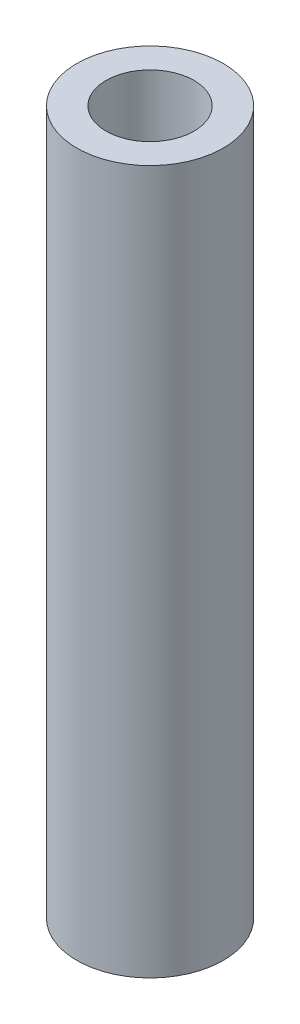
ISO-10303-21;
HEADER;
FILE_DESCRIPTION(('STEP AP214'),'2;1');
FILE_NAME('part.step','',(''),(''),'','','');
FILE_SCHEMA(('AUTOMOTIVE_DESIGN { 1 0 10303 214 1 1 1 1 }'));
ENDSEC;
DATA;
#1=APPLICATION_CONTEXT('core data for automotive mechanical design processes');
#2=APPLICATION_PROTOCOL_DEFINITION('international standard','automotive_design',2000,#1);
#3=PRODUCT_CONTEXT('',#1,'mechanical');
#4=PRODUCT('Part','Part','',(#3));
#5=PRODUCT_RELATED_PRODUCT_CATEGORY('part','',(#4));
#6=PRODUCT_DEFINITION_FORMATION('','',#4);
#7=PRODUCT_DEFINITION_CONTEXT('part definition',#1,'design');
#8=PRODUCT_DEFINITION('design','',#6,#7);
#9=PRODUCT_DEFINITION_SHAPE('','',#8);
#10=(LENGTH_UNIT() NAMED_UNIT(*) SI_UNIT(.MILLI.,.METRE.));
#11=(NAMED_UNIT(*) PLANE_ANGLE_UNIT() SI_UNIT($,.RADIAN.));
#12=(NAMED_UNIT(*) SI_UNIT($,.STERADIAN.) SOLID_ANGLE_UNIT());
#13=UNCERTAINTY_MEASURE_WITH_UNIT(LENGTH_MEASURE(1.E-05),#10,'distance_accuracy_value','');
#14=(GEOMETRIC_REPRESENTATION_CONTEXT(3) GLOBAL_UNCERTAINTY_ASSIGNED_CONTEXT((#13)) GLOBAL_UNIT_ASSIGNED_CONTEXT((#10,
#11,#12)) REPRESENTATION_CONTEXT('',''));
#15=CARTESIAN_POINT('',(0.,0.,0.));
#16=DIRECTION('',(0.,0.,1.));
#17=DIRECTION('',(1.,0.,0.));
#18=AXIS2_PLACEMENT_3D('',#15,#16,#17);
#19=CARTESIAN_POINT('',(0.,76.2,0.));
#20=DIRECTION('',(0.,1.,0.));
#21=DIRECTION('',(0.,0.,1.));
#22=AXIS2_PLACEMENT_3D('',#19,#20,#21);
#23=PLANE('',#22);
#24=CARTESIAN_POINT('',(0.,76.2,0.));
#25=DIRECTION('',(0.,1.,0.));
#26=DIRECTION('',(0.,0.,1.));
#27=AXIS2_PLACEMENT_3D('',#24,#25,#26);
#28=CIRCLE('',#27,7.9375);
#29=CARTESIAN_POINT('',(0.,76.2,-7.9375));
#30=VERTEX_POINT('',#29);
#31=EDGE_CURVE('E10',#30,#30,#28,.T.);
#32=ORIENTED_EDGE('',*,*,#31,.T.);
#33=EDGE_LOOP('',(#32));
#34=FACE_BOUND('',#33,.T.);
#35=CARTESIAN_POINT('',(0.,76.2,0.));
#36=DIRECTION('',(0.,1.,0.));
#37=DIRECTION('',(0.,0.,1.));
#38=AXIS2_PLACEMENT_3D('',#35,#36,#37);
#39=CIRCLE('',#38,4.7625);
#40=CARTESIAN_POINT('',(0.,76.2,-4.7625));
#41=VERTEX_POINT('',#40);
#42=EDGE_CURVE('E42',#41,#41,#39,.T.);
#43=ORIENTED_EDGE('',*,*,#42,.F.);
#44=EDGE_LOOP('',(#43));
#45=FACE_BOUND('',#44,.T.);
#46=ADVANCED_FACE('F31',(#34,#45),#23,.T.);
#47=CARTESIAN_POINT('',(0.,0.,0.));
#48=DIRECTION('',(0.,1.,0.));
#49=DIRECTION('',(0.,0.,1.));
#50=AXIS2_PLACEMENT_3D('',#47,#48,#49);
#51=PLANE('',#50);
#52=CARTESIAN_POINT('',(0.,0.,0.));
#53=DIRECTION('',(0.,1.,0.));
#54=DIRECTION('',(0.,0.,1.));
#55=AXIS2_PLACEMENT_3D('',#52,#53,#54);
#56=CIRCLE('',#55,7.9375);
#57=CARTESIAN_POINT('',(0.,0.,-7.9375));
#58=VERTEX_POINT('',#57);
#59=EDGE_CURVE('E35',#58,#58,#56,.T.);
#60=ORIENTED_EDGE('',*,*,#59,.F.);
#61=EDGE_LOOP('',(#60));
#62=FACE_BOUND('',#61,.T.);
#63=CARTESIAN_POINT('',(0.,0.,0.));
#64=DIRECTION('',(0.,1.,0.));
#65=DIRECTION('',(0.,0.,1.));
#66=AXIS2_PLACEMENT_3D('',#63,#64,#65);
#67=CIRCLE('',#66,4.7625);
#68=CARTESIAN_POINT('',(0.,0.,-4.7625));
#69=VERTEX_POINT('',#68);
#70=EDGE_CURVE('E44',#69,#69,#67,.T.);
#71=ORIENTED_EDGE('',*,*,#70,.T.);
#72=EDGE_LOOP('',(#71));
#73=FACE_BOUND('',#72,.T.);
#74=ADVANCED_FACE('F54',(#62,#73),#51,.F.);
#75=CARTESIAN_POINT('',(0.,76.2,0.));
#76=DIRECTION('',(0.,-1.,0.));
#77=DIRECTION('',(0.,0.,-1.));
#78=AXIS2_PLACEMENT_3D('',#75,#76,#77);
#79=CYLINDRICAL_SURFACE('',#78,7.9375);
#80=CARTESIAN_POINT('',(0.,76.2,-7.9375));
#81=CARTESIAN_POINT('',(0.,75.40625,-7.9375));
#82=CARTESIAN_POINT('',(0.,74.6125,-7.9375));
#83=CARTESIAN_POINT('',(0.,73.025,-7.9375));
#84=CARTESIAN_POINT('',(0.,72.23125,-7.9375));
#85=CARTESIAN_POINT('',(0.,70.64375,-7.9375));
#86=CARTESIAN_POINT('',(0.,69.85,-7.9375));
#87=CARTESIAN_POINT('',(0.,68.2625,-7.9375));
#88=CARTESIAN_POINT('',(0.,67.46875,-7.9375));
#89=CARTESIAN_POINT('',(0.,65.88125,-7.9375));
#90=CARTESIAN_POINT('',(0.,65.0875,-7.9375));
#91=CARTESIAN_POINT('',(0.,63.5,-7.9375));
#92=CARTESIAN_POINT('',(0.,62.70625,-7.9375));
#93=CARTESIAN_POINT('',(0.,61.11875,-7.9375));
#94=CARTESIAN_POINT('',(0.,60.325,-7.9375));
#95=CARTESIAN_POINT('',(0.,58.7375,-7.9375));
#96=CARTESIAN_POINT('',(0.,57.94375,-7.9375));
#97=CARTESIAN_POINT('',(0.,56.35625,-7.9375));
#98=CARTESIAN_POINT('',(0.,55.5625,-7.9375));
#99=CARTESIAN_POINT('',(0.,53.975,-7.9375));
#100=CARTESIAN_POINT('',(0.,53.18125,-7.9375));
#101=CARTESIAN_POINT('',(0.,51.59375,-7.9375));
#102=CARTESIAN_POINT('',(0.,50.8,-7.9375));
#103=CARTESIAN_POINT('',(0.,49.2125,-7.9375));
#104=CARTESIAN_POINT('',(0.,48.41875,-7.9375));
#105=CARTESIAN_POINT('',(0.,46.83125,-7.9375));
#106=CARTESIAN_POINT('',(0.,46.0375,-7.9375));
#107=CARTESIAN_POINT('',(0.,44.45,-7.9375));
#108=CARTESIAN_POINT('',(0.,43.65625,-7.9375));
#109=CARTESIAN_POINT('',(0.,42.06875,-7.9375));
#110=CARTESIAN_POINT('',(0.,41.275,-7.9375));
#111=CARTESIAN_POINT('',(0.,39.6875,-7.9375));
#112=CARTESIAN_POINT('',(0.,38.89375,-7.9375));
#113=CARTESIAN_POINT('',(0.,37.30625,-7.9375));
#114=CARTESIAN_POINT('',(0.,36.5125,-7.9375));
#115=CARTESIAN_POINT('',(0.,34.925,-7.9375));
#116=CARTESIAN_POINT('',(0.,34.13125,-7.9375));
#117=CARTESIAN_POINT('',(0.,32.54375,-7.9375));
#118=CARTESIAN_POINT('',(0.,31.75,-7.9375));
#119=CARTESIAN_POINT('',(0.,30.1625,-7.9375));
#120=CARTESIAN_POINT('',(0.,29.36875,-7.9375));
#121=CARTESIAN_POINT('',(0.,27.78125,-7.9375));
#122=CARTESIAN_POINT('',(0.,26.9875,-7.9375));
#123=CARTESIAN_POINT('',(0.,25.4,-7.9375));
#124=CARTESIAN_POINT('',(0.,24.60625,-7.9375));
#125=CARTESIAN_POINT('',(0.,23.01875,-7.9375));
#126=CARTESIAN_POINT('',(0.,22.225,-7.9375));
#127=CARTESIAN_POINT('',(0.,20.6375,-7.9375));
#128=CARTESIAN_POINT('',(0.,19.84375,-7.9375));
#129=CARTESIAN_POINT('',(0.,18.25625,-7.9375));
#130=CARTESIAN_POINT('',(0.,17.4625,-7.9375));
#131=CARTESIAN_POINT('',(0.,15.875,-7.9375));
#132=CARTESIAN_POINT('',(0.,15.08125,-7.9375));
#133=CARTESIAN_POINT('',(0.,13.49375,-7.9375));
#134=CARTESIAN_POINT('',(0.,12.7,-7.9375));
#135=CARTESIAN_POINT('',(0.,11.1125,-7.9375));
#136=CARTESIAN_POINT('',(0.,10.31875,-7.9375));
#137=CARTESIAN_POINT('',(0.,8.73125,-7.9375));
#138=CARTESIAN_POINT('',(0.,7.93750000000001,-7.9375));
#139=CARTESIAN_POINT('',(0.,6.35,-7.9375));
#140=CARTESIAN_POINT('',(0.,5.55625,-7.9375));
#141=CARTESIAN_POINT('',(0.,3.96875,-7.9375));
#142=CARTESIAN_POINT('',(0.,3.175,-7.9375));
#143=CARTESIAN_POINT('',(0.,1.5875,-7.9375));
#144=CARTESIAN_POINT('',(0.,0.793750000000001,-7.9375));
#145=CARTESIAN_POINT('',(0.,0.,-7.9375));
#146=B_SPLINE_CURVE_WITH_KNOTS('',3,(#80,#81,#82,#83,#84,#85,#86,#87,#88,#89,#90,#91,#92,#93,
#94,#95,#96,#97,#98,#99,#100,#101,#102,#103,#104,#105,#106,#107,#108,#109,#110,#111,#112,#113,
#114,#115,#116,#117,#118,#119,#120,#121,#122,#123,#124,#125,#126,#127,#128,#129,#130,#131,#132,
#133,#134,#135,#136,#137,#138,#139,#140,#141,#142,#143,#144,#145),.UNSPECIFIED.,.F.,.F.,(4,2,2,
2,2,2,2,2,2,2,2,2,2,2,2,2,2,2,2,2,2,2,2,2,2,2,2,2,2,2,2,2,4),(0.,2.38124999999999,
4.76249999999999,7.14374999999999,9.52499999999999,11.90625,14.2875,16.66875,19.05,21.43125,
23.8125,26.19375,28.575,30.95625,33.3375,35.71875,38.1,40.48125,42.8625,45.24375,47.625,
50.00625,52.3875,54.76875,57.15,59.53125,61.9125,64.29375,66.675,69.05625,71.4375,73.81875,
76.2),.UNSPECIFIED.);
#147=EDGE_CURVE('BSEAM33',#30,#58,#146,.T.);
#148=ORIENTED_EDGE('',*,*,#31,.F.);
#149=ORIENTED_EDGE('',*,*,#59,.T.);
#150=ORIENTED_EDGE('',*,*,#147,.T.);
#151=ORIENTED_EDGE('',*,*,#147,.F.);
#152=EDGE_LOOP('',(#148,#150,#149,#151));
#153=FACE_BOUND('',#152,.T.);
#154=ADVANCED_FACE('F33',(#153),#79,.T.);
#155=CARTESIAN_POINT('',(0.,76.2,0.));
#156=DIRECTION('',(0.,-1.,0.));
#157=DIRECTION('',(0.,0.,-1.));
#158=AXIS2_PLACEMENT_3D('',#155,#156,#157);
#159=CYLINDRICAL_SURFACE('',#158,4.7625);
#160=CARTESIAN_POINT('',(0.,76.2,-4.7625));
#161=CARTESIAN_POINT('',(0.,75.40625,-4.7625));
#162=CARTESIAN_POINT('',(0.,74.6125,-4.7625));
#163=CARTESIAN_POINT('',(0.,73.025,-4.7625));
#164=CARTESIAN_POINT('',(0.,72.23125,-4.7625));
#165=CARTESIAN_POINT('',(0.,70.64375,-4.7625));
#166=CARTESIAN_POINT('',(0.,69.85,-4.7625));
#167=CARTESIAN_POINT('',(0.,68.2625,-4.7625));
#168=CARTESIAN_POINT('',(0.,67.46875,-4.7625));
#169=CARTESIAN_POINT('',(0.,65.88125,-4.7625));
#170=CARTESIAN_POINT('',(0.,65.0875,-4.7625));
#171=CARTESIAN_POINT('',(0.,63.5,-4.7625));
#172=CARTESIAN_POINT('',(0.,62.70625,-4.7625));
#173=CARTESIAN_POINT('',(0.,61.11875,-4.7625));
#174=CARTESIAN_POINT('',(0.,60.325,-4.7625));
#175=CARTESIAN_POINT('',(0.,58.7375,-4.7625));
#176=CARTESIAN_POINT('',(0.,57.94375,-4.7625));
#177=CARTESIAN_POINT('',(0.,56.35625,-4.7625));
#178=CARTESIAN_POINT('',(0.,55.5625,-4.7625));
#179=CARTESIAN_POINT('',(0.,53.975,-4.7625));
#180=CARTESIAN_POINT('',(0.,53.18125,-4.7625));
#181=CARTESIAN_POINT('',(0.,51.59375,-4.7625));
#182=CARTESIAN_POINT('',(0.,50.8,-4.7625));
#183=CARTESIAN_POINT('',(0.,49.2125,-4.7625));
#184=CARTESIAN_POINT('',(0.,48.41875,-4.7625));
#185=CARTESIAN_POINT('',(0.,46.83125,-4.7625));
#186=CARTESIAN_POINT('',(0.,46.0375,-4.7625));
#187=CARTESIAN_POINT('',(0.,44.45,-4.7625));
#188=CARTESIAN_POINT('',(0.,43.65625,-4.7625));
#189=CARTESIAN_POINT('',(0.,42.06875,-4.7625));
#190=CARTESIAN_POINT('',(0.,41.275,-4.7625));
#191=CARTESIAN_POINT('',(0.,39.6875,-4.7625));
#192=CARTESIAN_POINT('',(0.,38.89375,-4.7625));
#193=CARTESIAN_POINT('',(0.,37.30625,-4.7625));
#194=CARTESIAN_POINT('',(0.,36.5125,-4.7625));
#195=CARTESIAN_POINT('',(0.,34.925,-4.7625));
#196=CARTESIAN_POINT('',(0.,34.13125,-4.7625));
#197=CARTESIAN_POINT('',(0.,32.54375,-4.7625));
#198=CARTESIAN_POINT('',(0.,31.75,-4.7625));
#199=CARTESIAN_POINT('',(0.,30.1625,-4.7625));
#200=CARTESIAN_POINT('',(0.,29.36875,-4.7625));
#201=CARTESIAN_POINT('',(0.,27.78125,-4.7625));
#202=CARTESIAN_POINT('',(0.,26.9875,-4.7625));
#203=CARTESIAN_POINT('',(0.,25.4,-4.7625));
#204=CARTESIAN_POINT('',(0.,24.60625,-4.7625));
#205=CARTESIAN_POINT('',(0.,23.01875,-4.7625));
#206=CARTESIAN_POINT('',(0.,22.225,-4.7625));
#207=CARTESIAN_POINT('',(0.,20.6375,-4.7625));
#208=CARTESIAN_POINT('',(0.,19.84375,-4.7625));
#209=CARTESIAN_POINT('',(0.,18.25625,-4.7625));
#210=CARTESIAN_POINT('',(0.,17.4625,-4.7625));
#211=CARTESIAN_POINT('',(0.,15.875,-4.7625));
#212=CARTESIAN_POINT('',(0.,15.08125,-4.7625));
#213=CARTESIAN_POINT('',(0.,13.49375,-4.7625));
#214=CARTESIAN_POINT('',(0.,12.7,-4.7625));
#215=CARTESIAN_POINT('',(0.,11.1125,-4.7625));
#216=CARTESIAN_POINT('',(0.,10.31875,-4.7625));
#217=CARTESIAN_POINT('',(0.,8.73125,-4.7625));
#218=CARTESIAN_POINT('',(0.,7.93750000000001,-4.7625));
#219=CARTESIAN_POINT('',(0.,6.35,-4.7625));
#220=CARTESIAN_POINT('',(0.,5.55625,-4.7625));
#221=CARTESIAN_POINT('',(0.,3.96875,-4.7625));
#222=CARTESIAN_POINT('',(0.,3.175,-4.7625));
#223=CARTESIAN_POINT('',(0.,1.5875,-4.7625));
#224=CARTESIAN_POINT('',(0.,0.793750000000001,-4.7625));
#225=CARTESIAN_POINT('',(0.,0.,-4.7625));
#226=B_SPLINE_CURVE_WITH_KNOTS('',3,(#160,#161,#162,#163,#164,#165,#166,#167,#168,#169,#170,
#171,#172,#173,#174,#175,#176,#177,#178,#179,#180,#181,#182,#183,#184,#185,#186,#187,#188,#189,
#190,#191,#192,#193,#194,#195,#196,#197,#198,#199,#200,#201,#202,#203,#204,#205,#206,#207,#208,
#209,#210,#211,#212,#213,#214,#215,#216,#217,#218,#219,#220,#221,#222,#223,#224,#225),
.UNSPECIFIED.,.F.,.F.,(4,2,2,2,2,2,2,2,2,2,2,2,2,2,2,2,2,2,2,2,2,2,2,2,2,2,2,2,2,2,2,2,4),(0.,
2.38125,4.7625,7.14375,9.52500000000001,11.90625,14.2875,16.66875,19.05,21.43125,23.8125,
26.19375,28.575,30.95625,33.3375,35.71875,38.1,40.48125,42.8625,45.24375,47.625,50.00625,
52.3875,54.76875,57.15,59.53125,61.9125,64.29375,66.675,69.05625,71.4375,73.81875,76.2),.UNSPECIFIED.);
#227=EDGE_CURVE('BSEAM50',#41,#69,#226,.T.);
#228=ORIENTED_EDGE('',*,*,#42,.T.);
#229=ORIENTED_EDGE('',*,*,#70,.F.);
#230=ORIENTED_EDGE('',*,*,#227,.T.);
#231=ORIENTED_EDGE('',*,*,#227,.F.);
#232=EDGE_LOOP('',(#228,#230,#229,#231));
#233=FACE_BOUND('',#232,.T.);
#234=ADVANCED_FACE('F50',(#233),#159,.F.);
#235=CLOSED_SHELL('',(#46,#74,#154,#234));
#236=MANIFOLD_SOLID_BREP('B2',#235);
#237=ADVANCED_BREP_SHAPE_REPRESENTATION('',(#18,#236),#14);
#238=SHAPE_DEFINITION_REPRESENTATION(#9,#237);
ENDSEC;
END-ISO-10303-21;
